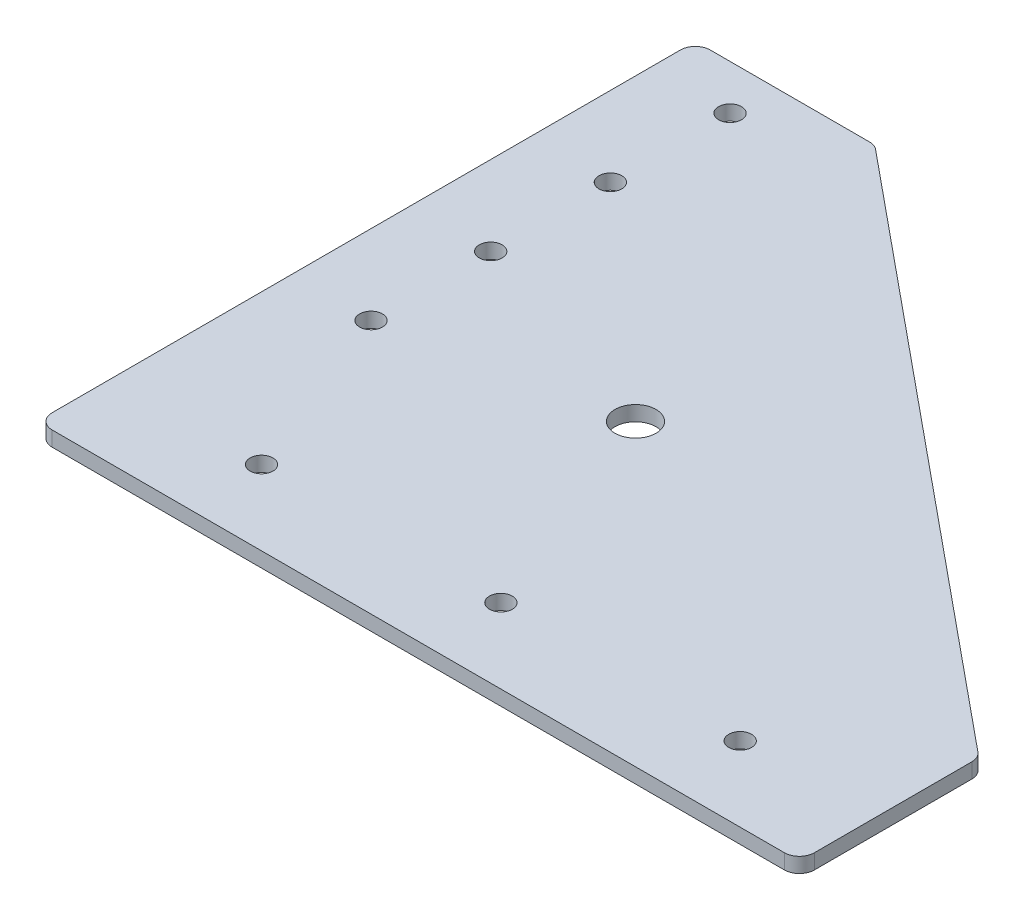
ISO-10303-21;
HEADER;
FILE_DESCRIPTION(('STEP AP214'),'2;1');
FILE_NAME('part.step','',(''),(''),'','','');
FILE_SCHEMA(('AUTOMOTIVE_DESIGN { 1 0 10303 214 1 1 1 1 }'));
ENDSEC;
DATA;
#1=APPLICATION_CONTEXT('core data for automotive mechanical design processes');
#2=APPLICATION_PROTOCOL_DEFINITION('international standard','automotive_design',2000,#1);
#3=PRODUCT_CONTEXT('',#1,'mechanical');
#4=PRODUCT('Part','Part','',(#3));
#5=PRODUCT_RELATED_PRODUCT_CATEGORY('part','',(#4));
#6=PRODUCT_DEFINITION_FORMATION('','',#4);
#7=PRODUCT_DEFINITION_CONTEXT('part definition',#1,'design');
#8=PRODUCT_DEFINITION('design','',#6,#7);
#9=PRODUCT_DEFINITION_SHAPE('','',#8);
#10=(LENGTH_UNIT() NAMED_UNIT(*) SI_UNIT(.MILLI.,.METRE.));
#11=(NAMED_UNIT(*) PLANE_ANGLE_UNIT() SI_UNIT($,.RADIAN.));
#12=(NAMED_UNIT(*) SI_UNIT($,.STERADIAN.) SOLID_ANGLE_UNIT());
#13=UNCERTAINTY_MEASURE_WITH_UNIT(LENGTH_MEASURE(1.E-05),#10,'distance_accuracy_value','');
#14=(GEOMETRIC_REPRESENTATION_CONTEXT(3) GLOBAL_UNCERTAINTY_ASSIGNED_CONTEXT((#13)) GLOBAL_UNIT_ASSIGNED_CONTEXT((#10,
#11,#12)) REPRESENTATION_CONTEXT('',''));
#15=CARTESIAN_POINT('',(0.,0.,0.));
#16=DIRECTION('',(0.,0.,1.));
#17=DIRECTION('',(1.,0.,0.));
#18=AXIS2_PLACEMENT_3D('',#15,#16,#17);
#19=CARTESIAN_POINT('',(0.,3.175,0.));
#20=DIRECTION('',(0.,1.,0.));
#21=DIRECTION('',(0.,0.,1.));
#22=AXIS2_PLACEMENT_3D('',#19,#20,#21);
#23=PLANE('',#22);
#24=CARTESIAN_POINT('',(63.5,3.175,-63.5));
#25=DIRECTION('',(0.,1.,0.));
#26=DIRECTION('',(0.,0.,1.));
#27=AXIS2_PLACEMENT_3D('',#24,#25,#26);
#28=CIRCLE('',#27,4.36880000000001);
#29=CARTESIAN_POINT('',(63.5,3.175,-59.1312));
#30=VERTEX_POINT('',#29);
#31=EDGE_CURVE('E241',#30,#30,#28,.T.);
#32=ORIENTED_EDGE('',*,*,#31,.F.);
#33=EDGE_LOOP('',(#32));
#34=FACE_BOUND('',#33,.T.);
#35=CARTESIAN_POINT('',(16.8909999999998,3.175,-104.775));
#36=DIRECTION('',(0.,1.,0.));
#37=DIRECTION('',(0.,0.,1.));
#38=AXIS2_PLACEMENT_3D('',#35,#36,#37);
#39=CIRCLE('',#38,2.4257);
#40=CARTESIAN_POINT('',(16.8909999999998,3.175,-102.3493));
#41=VERTEX_POINT('',#40);
#42=EDGE_CURVE('E226',#41,#41,#39,.T.);
#43=ORIENTED_EDGE('',*,*,#42,.F.);
#44=EDGE_LOOP('',(#43));
#45=FACE_BOUND('',#44,.T.);
#46=CARTESIAN_POINT('',(133.35,3.175,-15.875));
#47=DIRECTION('',(0.,1.,0.));
#48=DIRECTION('',(0.,0.,1.));
#49=AXIS2_PLACEMENT_3D('',#46,#47,#48);
#50=CIRCLE('',#49,2.4257);
#51=CARTESIAN_POINT('',(133.35,3.175,-13.4493));
#52=VERTEX_POINT('',#51);
#53=EDGE_CURVE('E214',#52,#52,#50,.T.);
#54=ORIENTED_EDGE('',*,*,#53,.F.);
#55=EDGE_LOOP('',(#54));
#56=FACE_BOUND('',#55,.T.);
#57=CARTESIAN_POINT('',(16.891,3.175,-53.975));
#58=DIRECTION('',(0.,1.,0.));
#59=DIRECTION('',(0.,0.,1.));
#60=AXIS2_PLACEMENT_3D('',#57,#58,#59);
#61=CIRCLE('',#60,2.4257);
#62=CARTESIAN_POINT('',(16.891,3.175,-51.5493));
#63=VERTEX_POINT('',#62);
#64=EDGE_CURVE('E203',#63,#63,#61,.T.);
#65=ORIENTED_EDGE('',*,*,#64,.F.);
#66=EDGE_LOOP('',(#65));
#67=FACE_BOUND('',#66,.T.);
#68=DIRECTION('',(-0.77273357349735,0.,-0.634730513202269));
#69=VECTOR('',#68,1.);
#70=CARTESIAN_POINT('',(38.1,3.175,-139.7));
#71=LINE('',#70,#69);
#72=CARTESIAN_POINT('',(160.630133714507,3.175,-39.0526134714806));
#73=VERTEX_POINT('',#72);
#74=CARTESIAN_POINT('',(38.9784547956886,3.175,-138.978429095854));
#75=VERTEX_POINT('',#74);
#76=EDGE_CURVE('E195',#73,#75,#71,.T.);
#77=ORIENTED_EDGE('',*,*,#76,.T.);
#78=CARTESIAN_POINT('',(36.9631854162714,3.175,-136.525));
#79=DIRECTION('',(0.,1.,0.));
#80=DIRECTION('',(0.,0.,1.));
#81=AXIS2_PLACEMENT_3D('',#78,#79,#80);
#82=CIRCLE('',#81,3.175);
#83=CARTESIAN_POINT('',(36.9631854162714,3.175,-139.7));
#84=VERTEX_POINT('',#83);
#85=EDGE_CURVE('E163',#75,#84,#82,.T.);
#86=ORIENTED_EDGE('',*,*,#85,.T.);
#87=DIRECTION('',(-1.,0.,0.));
#88=VECTOR('',#87,1.);
#89=CARTESIAN_POINT('',(0.,3.175,-139.7));
#90=LINE('',#89,#88);
#91=CARTESIAN_POINT('',(3.175,3.175,-139.7));
#92=VERTEX_POINT('',#91);
#93=EDGE_CURVE('E129',#84,#92,#90,.T.);
#94=ORIENTED_EDGE('',*,*,#93,.T.);
#95=CARTESIAN_POINT('',(3.175,3.175,-136.525));
#96=DIRECTION('',(0.,1.,0.));
#97=DIRECTION('',(0.,0.,1.));
#98=AXIS2_PLACEMENT_3D('',#95,#96,#97);
#99=CIRCLE('',#98,3.175);
#100=CARTESIAN_POINT('',(0.,3.175,-136.525));
#101=VERTEX_POINT('',#100);
#102=EDGE_CURVE('E54',#92,#101,#99,.T.);
#103=ORIENTED_EDGE('',*,*,#102,.T.);
#104=DIRECTION('',(0.,0.,1.));
#105=VECTOR('',#104,1.);
#106=CARTESIAN_POINT('',(0.,3.175,0.));
#107=LINE('',#106,#105);
#108=CARTESIAN_POINT('',(0.,3.175,-3.175));
#109=VERTEX_POINT('',#108);
#110=EDGE_CURVE('E145',#101,#109,#107,.T.);
#111=ORIENTED_EDGE('',*,*,#110,.T.);
#112=CARTESIAN_POINT('',(3.175,3.175,-3.175));
#113=DIRECTION('',(0.,1.,0.));
#114=DIRECTION('',(0.,0.,1.));
#115=AXIS2_PLACEMENT_3D('',#112,#113,#114);
#116=CIRCLE('',#115,3.175);
#117=CARTESIAN_POINT('',(3.175,3.175,0.));
#118=VERTEX_POINT('',#117);
#119=EDGE_CURVE('E156',#109,#118,#116,.T.);
#120=ORIENTED_EDGE('',*,*,#119,.T.);
#121=DIRECTION('',(1.,0.,0.));
#122=VECTOR('',#121,1.);
#123=CARTESIAN_POINT('',(0.,3.175,0.));
#124=LINE('',#123,#122);
#125=CARTESIAN_POINT('',(158.61486433509,3.175,0.));
#126=VERTEX_POINT('',#125);
#127=EDGE_CURVE('E139',#118,#126,#124,.T.);
#128=ORIENTED_EDGE('',*,*,#127,.T.);
#129=CARTESIAN_POINT('',(158.61486433509,3.175,-3.17500000000001));
#130=DIRECTION('',(0.,1.,0.));
#131=DIRECTION('',(0.,0.,1.));
#132=AXIS2_PLACEMENT_3D('',#129,#130,#131);
#133=CIRCLE('',#132,3.175);
#134=CARTESIAN_POINT('',(161.78986433509,3.175,-3.175));
#135=VERTEX_POINT('',#134);
#136=EDGE_CURVE('E158',#126,#135,#133,.T.);
#137=ORIENTED_EDGE('',*,*,#136,.T.);
#138=DIRECTION('',(0.,0.,-1.));
#139=VECTOR('',#138,1.);
#140=CARTESIAN_POINT('',(161.78986433509,3.175,0.));
#141=LINE('',#140,#139);
#142=CARTESIAN_POINT('',(161.78986433509,3.175,-36.5991843756265));
#143=VERTEX_POINT('',#142);
#144=EDGE_CURVE('E198',#135,#143,#141,.T.);
#145=ORIENTED_EDGE('',*,*,#144,.T.);
#146=CARTESIAN_POINT('',(158.61486433509,3.175,-36.5991843756265));
#147=DIRECTION('',(0.,1.,0.));
#148=DIRECTION('',(0.,0.,1.));
#149=AXIS2_PLACEMENT_3D('',#146,#147,#148);
#150=CIRCLE('',#149,3.175);
#151=EDGE_CURVE('E160',#143,#73,#150,.T.);
#152=ORIENTED_EDGE('',*,*,#151,.T.);
#153=EDGE_LOOP('',(#77,#86,#94,#103,#111,#120,#128,#137,#145,#152));
#154=FACE_BOUND('',#153,.T.);
#155=CARTESIAN_POINT('',(31.75,3.175,-15.875));
#156=DIRECTION('',(0.,1.,0.));
#157=DIRECTION('',(0.,0.,1.));
#158=AXIS2_PLACEMENT_3D('',#155,#156,#157);
#159=CIRCLE('',#158,2.4257);
#160=CARTESIAN_POINT('',(31.75,3.175,-13.4493));
#161=VERTEX_POINT('',#160);
#162=EDGE_CURVE('E186',#161,#161,#159,.T.);
#163=ORIENTED_EDGE('',*,*,#162,.F.);
#164=EDGE_LOOP('',(#163));
#165=FACE_BOUND('',#164,.T.);
#166=CARTESIAN_POINT('',(82.55,3.175,-15.875));
#167=DIRECTION('',(0.,1.,0.));
#168=DIRECTION('',(0.,0.,1.));
#169=AXIS2_PLACEMENT_3D('',#166,#167,#168);
#170=CIRCLE('',#169,2.42570000000001);
#171=CARTESIAN_POINT('',(82.55,3.175,-13.4493));
#172=VERTEX_POINT('',#171);
#173=EDGE_CURVE('E208',#172,#172,#170,.T.);
#174=ORIENTED_EDGE('',*,*,#173,.F.);
#175=EDGE_LOOP('',(#174));
#176=FACE_BOUND('',#175,.T.);
#177=CARTESIAN_POINT('',(16.8909999999999,3.175,-79.375));
#178=DIRECTION('',(0.,1.,0.));
#179=DIRECTION('',(0.,0.,1.));
#180=AXIS2_PLACEMENT_3D('',#177,#178,#179);
#181=CIRCLE('',#180,2.4257);
#182=CARTESIAN_POINT('',(16.8909999999999,3.175,-76.9493));
#183=VERTEX_POINT('',#182);
#184=EDGE_CURVE('E220',#183,#183,#181,.T.);
#185=ORIENTED_EDGE('',*,*,#184,.F.);
#186=EDGE_LOOP('',(#185));
#187=FACE_BOUND('',#186,.T.);
#188=CARTESIAN_POINT('',(16.8909999999997,3.175,-130.175));
#189=DIRECTION('',(0.,1.,0.));
#190=DIRECTION('',(0.,0.,1.));
#191=AXIS2_PLACEMENT_3D('',#188,#189,#190);
#192=CIRCLE('',#191,2.4257);
#193=CARTESIAN_POINT('',(16.8909999999997,3.175,-127.7493));
#194=VERTEX_POINT('',#193);
#195=EDGE_CURVE('E232',#194,#194,#192,.T.);
#196=ORIENTED_EDGE('',*,*,#195,.F.);
#197=EDGE_LOOP('',(#196));
#198=FACE_BOUND('',#197,.T.);
#199=ADVANCED_FACE('F32',(#34,#45,#56,#67,#154,#165,#176,#187,#198),#23,.T.);
#200=CARTESIAN_POINT('',(0.,0.,0.));
#201=DIRECTION('',(0.,1.,0.));
#202=DIRECTION('',(0.,0.,1.));
#203=AXIS2_PLACEMENT_3D('',#200,#201,#202);
#204=PLANE('',#203);
#205=CARTESIAN_POINT('',(63.5,0.,-63.5));
#206=DIRECTION('',(0.,1.,0.));
#207=DIRECTION('',(0.,0.,1.));
#208=AXIS2_PLACEMENT_3D('',#205,#206,#207);
#209=CIRCLE('',#208,4.36880000000001);
#210=CARTESIAN_POINT('',(63.5,0.,-59.1312));
#211=VERTEX_POINT('',#210);
#212=EDGE_CURVE('E238',#211,#211,#209,.T.);
#213=ORIENTED_EDGE('',*,*,#212,.T.);
#214=EDGE_LOOP('',(#213));
#215=FACE_BOUND('',#214,.T.);
#216=DIRECTION('',(-1.,0.,0.));
#217=VECTOR('',#216,1.);
#218=CARTESIAN_POINT('',(0.,0.,-139.7));
#219=LINE('',#218,#217);
#220=CARTESIAN_POINT('',(36.9631854162714,0.,-139.7));
#221=VERTEX_POINT('',#220);
#222=CARTESIAN_POINT('',(3.175,0.,-139.7));
#223=VERTEX_POINT('',#222);
#224=EDGE_CURVE('E127',#221,#223,#219,.T.);
#225=ORIENTED_EDGE('',*,*,#224,.F.);
#226=CARTESIAN_POINT('',(36.9631854162714,0.,-136.525));
#227=DIRECTION('',(0.,1.,0.));
#228=DIRECTION('',(0.,0.,1.));
#229=AXIS2_PLACEMENT_3D('',#226,#227,#228);
#230=CIRCLE('',#229,3.175);
#231=CARTESIAN_POINT('',(38.9784547956886,0.,-138.978429095854));
#232=VERTEX_POINT('',#231);
#233=EDGE_CURVE('E110',#221,#232,#230,.F.);
#234=ORIENTED_EDGE('',*,*,#233,.T.);
#235=DIRECTION('',(-0.77273357349735,0.,-0.634730513202269));
#236=VECTOR('',#235,1.);
#237=CARTESIAN_POINT('',(38.1,0.,-139.7));
#238=LINE('',#237,#236);
#239=CARTESIAN_POINT('',(160.630133714507,0.,-39.0526134714806));
#240=VERTEX_POINT('',#239);
#241=EDGE_CURVE('E137',#240,#232,#238,.T.);
#242=ORIENTED_EDGE('',*,*,#241,.F.);
#243=CARTESIAN_POINT('',(158.61486433509,0.,-36.5991843756265));
#244=DIRECTION('',(0.,1.,0.));
#245=DIRECTION('',(0.,0.,1.));
#246=AXIS2_PLACEMENT_3D('',#243,#244,#245);
#247=CIRCLE('',#246,3.175);
#248=CARTESIAN_POINT('',(161.78986433509,0.,-36.5991843756265));
#249=VERTEX_POINT('',#248);
#250=EDGE_CURVE('E150',#240,#249,#247,.F.);
#251=ORIENTED_EDGE('',*,*,#250,.T.);
#252=DIRECTION('',(0.,0.,-1.));
#253=VECTOR('',#252,1.);
#254=CARTESIAN_POINT('',(161.78986433509,0.,0.));
#255=LINE('',#254,#253);
#256=CARTESIAN_POINT('',(161.78986433509,0.,-3.175));
#257=VERTEX_POINT('',#256);
#258=EDGE_CURVE('E141',#257,#249,#255,.T.);
#259=ORIENTED_EDGE('',*,*,#258,.F.);
#260=CARTESIAN_POINT('',(158.61486433509,0.,-3.17500000000001));
#261=DIRECTION('',(0.,1.,0.));
#262=DIRECTION('',(0.,0.,1.));
#263=AXIS2_PLACEMENT_3D('',#260,#261,#262);
#264=CIRCLE('',#263,3.175);
#265=CARTESIAN_POINT('',(158.61486433509,0.,0.));
#266=VERTEX_POINT('',#265);
#267=EDGE_CURVE('E148',#257,#266,#264,.F.);
#268=ORIENTED_EDGE('',*,*,#267,.T.);
#269=DIRECTION('',(1.,0.,0.));
#270=VECTOR('',#269,1.);
#271=CARTESIAN_POINT('',(0.,0.,0.));
#272=LINE('',#271,#270);
#273=CARTESIAN_POINT('',(3.175,0.,0.));
#274=VERTEX_POINT('',#273);
#275=EDGE_CURVE('E180',#274,#266,#272,.T.);
#276=ORIENTED_EDGE('',*,*,#275,.F.);
#277=CARTESIAN_POINT('',(3.175,0.,-3.175));
#278=DIRECTION('',(0.,1.,0.));
#279=DIRECTION('',(0.,0.,1.));
#280=AXIS2_PLACEMENT_3D('',#277,#278,#279);
#281=CIRCLE('',#280,3.175);
#282=CARTESIAN_POINT('',(0.,0.,-3.175));
#283=VERTEX_POINT('',#282);
#284=EDGE_CURVE('E130',#274,#283,#281,.F.);
#285=ORIENTED_EDGE('',*,*,#284,.T.);
#286=DIRECTION('',(0.,0.,1.));
#287=VECTOR('',#286,1.);
#288=CARTESIAN_POINT('',(0.,0.,0.));
#289=LINE('',#288,#287);
#290=CARTESIAN_POINT('',(0.,0.,-136.525));
#291=VERTEX_POINT('',#290);
#292=EDGE_CURVE('E136',#291,#283,#289,.T.);
#293=ORIENTED_EDGE('',*,*,#292,.F.);
#294=CARTESIAN_POINT('',(3.175,0.,-136.525));
#295=DIRECTION('',(0.,1.,0.));
#296=DIRECTION('',(0.,0.,1.));
#297=AXIS2_PLACEMENT_3D('',#294,#295,#296);
#298=CIRCLE('',#297,3.175);
#299=EDGE_CURVE('E121',#291,#223,#298,.F.);
#300=ORIENTED_EDGE('',*,*,#299,.T.);
#301=EDGE_LOOP('',(#225,#234,#242,#251,#259,#268,#276,#285,#293,#300));
#302=FACE_BOUND('',#301,.T.);
#303=CARTESIAN_POINT('',(31.75,0.,-15.875));
#304=DIRECTION('',(0.,1.,0.));
#305=DIRECTION('',(0.,0.,1.));
#306=AXIS2_PLACEMENT_3D('',#303,#304,#305);
#307=CIRCLE('',#306,2.4257);
#308=CARTESIAN_POINT('',(31.75,0.,-13.4493));
#309=VERTEX_POINT('',#308);
#310=EDGE_CURVE('E190',#309,#309,#307,.T.);
#311=ORIENTED_EDGE('',*,*,#310,.T.);
#312=EDGE_LOOP('',(#311));
#313=FACE_BOUND('',#312,.T.);
#314=CARTESIAN_POINT('',(16.891,0.,-53.975));
#315=DIRECTION('',(0.,1.,0.));
#316=DIRECTION('',(0.,0.,1.));
#317=AXIS2_PLACEMENT_3D('',#314,#315,#316);
#318=CIRCLE('',#317,2.4257);
#319=CARTESIAN_POINT('',(16.891,0.,-51.5493));
#320=VERTEX_POINT('',#319);
#321=EDGE_CURVE('E205',#320,#320,#318,.T.);
#322=ORIENTED_EDGE('',*,*,#321,.T.);
#323=EDGE_LOOP('',(#322));
#324=FACE_BOUND('',#323,.T.);
#325=CARTESIAN_POINT('',(82.55,0.,-15.875));
#326=DIRECTION('',(0.,1.,0.));
#327=DIRECTION('',(0.,0.,1.));
#328=AXIS2_PLACEMENT_3D('',#325,#326,#327);
#329=CIRCLE('',#328,2.42570000000001);
#330=CARTESIAN_POINT('',(82.55,0.,-13.4493));
#331=VERTEX_POINT('',#330);
#332=EDGE_CURVE('E211',#331,#331,#329,.T.);
#333=ORIENTED_EDGE('',*,*,#332,.T.);
#334=EDGE_LOOP('',(#333));
#335=FACE_BOUND('',#334,.T.);
#336=CARTESIAN_POINT('',(133.35,0.,-15.875));
#337=DIRECTION('',(0.,1.,0.));
#338=DIRECTION('',(0.,0.,1.));
#339=AXIS2_PLACEMENT_3D('',#336,#337,#338);
#340=CIRCLE('',#339,2.4257);
#341=CARTESIAN_POINT('',(133.35,0.,-13.4493));
#342=VERTEX_POINT('',#341);
#343=EDGE_CURVE('E217',#342,#342,#340,.T.);
#344=ORIENTED_EDGE('',*,*,#343,.T.);
#345=EDGE_LOOP('',(#344));
#346=FACE_BOUND('',#345,.T.);
#347=CARTESIAN_POINT('',(16.8909999999999,0.,-79.375));
#348=DIRECTION('',(0.,1.,0.));
#349=DIRECTION('',(0.,0.,1.));
#350=AXIS2_PLACEMENT_3D('',#347,#348,#349);
#351=CIRCLE('',#350,2.4257);
#352=CARTESIAN_POINT('',(16.8909999999999,0.,-76.9493));
#353=VERTEX_POINT('',#352);
#354=EDGE_CURVE('E223',#353,#353,#351,.T.);
#355=ORIENTED_EDGE('',*,*,#354,.T.);
#356=EDGE_LOOP('',(#355));
#357=FACE_BOUND('',#356,.T.);
#358=CARTESIAN_POINT('',(16.8909999999998,0.,-104.775));
#359=DIRECTION('',(0.,1.,0.));
#360=DIRECTION('',(0.,0.,1.));
#361=AXIS2_PLACEMENT_3D('',#358,#359,#360);
#362=CIRCLE('',#361,2.4257);
#363=CARTESIAN_POINT('',(16.8909999999998,0.,-102.3493));
#364=VERTEX_POINT('',#363);
#365=EDGE_CURVE('E229',#364,#364,#362,.T.);
#366=ORIENTED_EDGE('',*,*,#365,.T.);
#367=EDGE_LOOP('',(#366));
#368=FACE_BOUND('',#367,.T.);
#369=CARTESIAN_POINT('',(16.8909999999997,0.,-130.175));
#370=DIRECTION('',(0.,1.,0.));
#371=DIRECTION('',(0.,0.,1.));
#372=AXIS2_PLACEMENT_3D('',#369,#370,#371);
#373=CIRCLE('',#372,2.4257);
#374=CARTESIAN_POINT('',(16.8909999999997,0.,-127.7493));
#375=VERTEX_POINT('',#374);
#376=EDGE_CURVE('E235',#375,#375,#373,.T.);
#377=ORIENTED_EDGE('',*,*,#376,.T.);
#378=EDGE_LOOP('',(#377));
#379=FACE_BOUND('',#378,.T.);
#380=ADVANCED_FACE('F133',(#215,#302,#313,#324,#335,#346,#357,#368,#379),#204,.F.);
#381=CARTESIAN_POINT('',(0.,3.175,0.));
#382=DIRECTION('',(0.,0.,-1.));
#383=DIRECTION('',(-1.,0.,0.));
#384=AXIS2_PLACEMENT_3D('',#381,#382,#383);
#385=PLANE('',#384);
#386=ORIENTED_EDGE('',*,*,#275,.T.);
#387=DIRECTION('',(0.,-1.,0.));
#388=VECTOR('',#387,1.);
#389=CARTESIAN_POINT('',(158.61486433509,3.175,0.));
#390=LINE('',#389,#388);
#391=EDGE_CURVE('E11',#266,#126,#390,.F.);
#392=ORIENTED_EDGE('',*,*,#391,.T.);
#393=ORIENTED_EDGE('',*,*,#127,.F.);
#394=DIRECTION('',(0.,-1.,0.));
#395=VECTOR('',#394,1.);
#396=CARTESIAN_POINT('',(3.175,3.175,0.));
#397=LINE('',#396,#395);
#398=EDGE_CURVE('E40',#118,#274,#397,.T.);
#399=ORIENTED_EDGE('',*,*,#398,.T.);
#400=EDGE_LOOP('',(#386,#392,#393,#399));
#401=FACE_BOUND('',#400,.T.);
#402=ADVANCED_FACE('F179',(#401),#385,.F.);
#403=CARTESIAN_POINT('',(161.78986433509,3.175,0.));
#404=DIRECTION('',(-1.,0.,0.));
#405=DIRECTION('',(0.,0.,1.));
#406=AXIS2_PLACEMENT_3D('',#403,#404,#405);
#407=PLANE('',#406);
#408=ORIENTED_EDGE('',*,*,#258,.T.);
#409=DIRECTION('',(0.,-1.,0.));
#410=VECTOR('',#409,1.);
#411=CARTESIAN_POINT('',(161.78986433509,3.175,-36.5991843756265));
#412=LINE('',#411,#410);
#413=EDGE_CURVE('E172',#249,#143,#412,.F.);
#414=ORIENTED_EDGE('',*,*,#413,.T.);
#415=ORIENTED_EDGE('',*,*,#144,.F.);
#416=DIRECTION('',(0.,-1.,0.));
#417=VECTOR('',#416,1.);
#418=CARTESIAN_POINT('',(161.78986433509,3.175,-3.175));
#419=LINE('',#418,#417);
#420=EDGE_CURVE('E169',#135,#257,#419,.T.);
#421=ORIENTED_EDGE('',*,*,#420,.T.);
#422=EDGE_LOOP('',(#408,#414,#415,#421));
#423=FACE_BOUND('',#422,.T.);
#424=ADVANCED_FACE('F284',(#423),#407,.F.);
#425=CARTESIAN_POINT('',(38.1,3.175,-139.7));
#426=DIRECTION('',(-0.634730513202269,0.,0.77273357349735));
#427=DIRECTION('',(0.77273357349735,0.,0.634730513202269));
#428=AXIS2_PLACEMENT_3D('',#425,#426,#427);
#429=PLANE('',#428);
#430=ORIENTED_EDGE('',*,*,#241,.T.);
#431=DIRECTION('',(0.,-1.,0.));
#432=VECTOR('',#431,1.);
#433=CARTESIAN_POINT('',(38.9784547956886,3.175,-138.978429095854));
#434=LINE('',#433,#432);
#435=EDGE_CURVE('E115',#232,#75,#434,.F.);
#436=ORIENTED_EDGE('',*,*,#435,.T.);
#437=ORIENTED_EDGE('',*,*,#76,.F.);
#438=DIRECTION('',(0.,-1.,0.));
#439=VECTOR('',#438,1.);
#440=CARTESIAN_POINT('',(160.630133714507,3.175,-39.0526134714806));
#441=LINE('',#440,#439);
#442=EDGE_CURVE('E120',#73,#240,#441,.T.);
#443=ORIENTED_EDGE('',*,*,#442,.T.);
#444=EDGE_LOOP('',(#430,#436,#437,#443));
#445=FACE_BOUND('',#444,.T.);
#446=ADVANCED_FACE('F294',(#445),#429,.F.);
#447=CARTESIAN_POINT('',(0.,3.175,-139.7));
#448=DIRECTION('',(0.,0.,1.));
#449=DIRECTION('',(1.,0.,0.));
#450=AXIS2_PLACEMENT_3D('',#447,#448,#449);
#451=PLANE('',#450);
#452=ORIENTED_EDGE('',*,*,#93,.F.);
#453=DIRECTION('',(0.,-1.,0.));
#454=VECTOR('',#453,1.);
#455=CARTESIAN_POINT('',(36.9631854162714,3.175,-139.7));
#456=LINE('',#455,#454);
#457=EDGE_CURVE('E114',#84,#221,#456,.T.);
#458=ORIENTED_EDGE('',*,*,#457,.T.);
#459=ORIENTED_EDGE('',*,*,#224,.T.);
#460=DIRECTION('',(0.,-1.,0.));
#461=VECTOR('',#460,1.);
#462=CARTESIAN_POINT('',(3.175,3.175,-139.7));
#463=LINE('',#462,#461);
#464=EDGE_CURVE('E131',#223,#92,#463,.F.);
#465=ORIENTED_EDGE('',*,*,#464,.T.);
#466=EDGE_LOOP('',(#452,#458,#459,#465));
#467=FACE_BOUND('',#466,.T.);
#468=ADVANCED_FACE('F126',(#467),#451,.F.);
#469=CARTESIAN_POINT('',(0.,3.175,0.));
#470=DIRECTION('',(1.,0.,0.));
#471=DIRECTION('',(0.,0.,-1.));
#472=AXIS2_PLACEMENT_3D('',#469,#470,#471);
#473=PLANE('',#472);
#474=ORIENTED_EDGE('',*,*,#110,.F.);
#475=DIRECTION('',(0.,-1.,0.));
#476=VECTOR('',#475,1.);
#477=CARTESIAN_POINT('',(0.,3.175,-136.525));
#478=LINE('',#477,#476);
#479=EDGE_CURVE('E166',#101,#291,#478,.T.);
#480=ORIENTED_EDGE('',*,*,#479,.T.);
#481=ORIENTED_EDGE('',*,*,#292,.T.);
#482=DIRECTION('',(0.,-1.,0.));
#483=VECTOR('',#482,1.);
#484=CARTESIAN_POINT('',(0.,3.175,-3.175));
#485=LINE('',#484,#483);
#486=EDGE_CURVE('E47',#283,#109,#485,.F.);
#487=ORIENTED_EDGE('',*,*,#486,.T.);
#488=EDGE_LOOP('',(#474,#480,#481,#487));
#489=FACE_BOUND('',#488,.T.);
#490=ADVANCED_FACE('F288',(#489),#473,.F.);
#491=CARTESIAN_POINT('',(31.75,3.175,-15.875));
#492=DIRECTION('',(0.,-1.,0.));
#493=DIRECTION('',(0.,0.,-1.));
#494=AXIS2_PLACEMENT_3D('',#491,#492,#493);
#495=CYLINDRICAL_SURFACE('',#494,2.4257);
#496=ORIENTED_EDGE('',*,*,#162,.T.);
#497=EDGE_LOOP('',(#496));
#498=FACE_BOUND('',#497,.T.);
#499=ORIENTED_EDGE('',*,*,#310,.F.);
#500=EDGE_LOOP('',(#499));
#501=FACE_BOUND('',#500,.T.);
#502=ADVANCED_FACE('F291',(#498,#501),#495,.F.);
#503=CARTESIAN_POINT('',(16.891,3.175,-53.975));
#504=DIRECTION('',(0.,-1.,0.));
#505=DIRECTION('',(0.,0.,-1.));
#506=AXIS2_PLACEMENT_3D('',#503,#504,#505);
#507=CYLINDRICAL_SURFACE('',#506,2.4257);
#508=ORIENTED_EDGE('',*,*,#64,.T.);
#509=EDGE_LOOP('',(#508));
#510=FACE_BOUND('',#509,.T.);
#511=ORIENTED_EDGE('',*,*,#321,.F.);
#512=EDGE_LOOP('',(#511));
#513=FACE_BOUND('',#512,.T.);
#514=ADVANCED_FACE('F376',(#510,#513),#507,.F.);
#515=CARTESIAN_POINT('',(82.55,3.175,-15.875));
#516=DIRECTION('',(0.,-1.,0.));
#517=DIRECTION('',(0.,0.,-1.));
#518=AXIS2_PLACEMENT_3D('',#515,#516,#517);
#519=CYLINDRICAL_SURFACE('',#518,2.42570000000001);
#520=ORIENTED_EDGE('',*,*,#173,.T.);
#521=EDGE_LOOP('',(#520));
#522=FACE_BOUND('',#521,.T.);
#523=ORIENTED_EDGE('',*,*,#332,.F.);
#524=EDGE_LOOP('',(#523));
#525=FACE_BOUND('',#524,.T.);
#526=ADVANCED_FACE('F384',(#522,#525),#519,.F.);
#527=CARTESIAN_POINT('',(133.35,3.175,-15.875));
#528=DIRECTION('',(0.,-1.,0.));
#529=DIRECTION('',(0.,0.,-1.));
#530=AXIS2_PLACEMENT_3D('',#527,#528,#529);
#531=CYLINDRICAL_SURFACE('',#530,2.4257);
#532=ORIENTED_EDGE('',*,*,#53,.T.);
#533=EDGE_LOOP('',(#532));
#534=FACE_BOUND('',#533,.T.);
#535=ORIENTED_EDGE('',*,*,#343,.F.);
#536=EDGE_LOOP('',(#535));
#537=FACE_BOUND('',#536,.T.);
#538=ADVANCED_FACE('F393',(#534,#537),#531,.F.);
#539=CARTESIAN_POINT('',(16.8909999999999,3.175,-79.375));
#540=DIRECTION('',(0.,-1.,0.));
#541=DIRECTION('',(0.,0.,-1.));
#542=AXIS2_PLACEMENT_3D('',#539,#540,#541);
#543=CYLINDRICAL_SURFACE('',#542,2.4257);
#544=ORIENTED_EDGE('',*,*,#184,.T.);
#545=EDGE_LOOP('',(#544));
#546=FACE_BOUND('',#545,.T.);
#547=ORIENTED_EDGE('',*,*,#354,.F.);
#548=EDGE_LOOP('',(#547));
#549=FACE_BOUND('',#548,.T.);
#550=ADVANCED_FACE('F402',(#546,#549),#543,.F.);
#551=CARTESIAN_POINT('',(16.8909999999998,3.175,-104.775));
#552=DIRECTION('',(0.,-1.,0.));
#553=DIRECTION('',(0.,0.,-1.));
#554=AXIS2_PLACEMENT_3D('',#551,#552,#553);
#555=CYLINDRICAL_SURFACE('',#554,2.4257);
#556=ORIENTED_EDGE('',*,*,#42,.T.);
#557=EDGE_LOOP('',(#556));
#558=FACE_BOUND('',#557,.T.);
#559=ORIENTED_EDGE('',*,*,#365,.F.);
#560=EDGE_LOOP('',(#559));
#561=FACE_BOUND('',#560,.T.);
#562=ADVANCED_FACE('F275',(#558,#561),#555,.F.);
#563=CARTESIAN_POINT('',(16.8909999999997,3.175,-130.175));
#564=DIRECTION('',(0.,-1.,0.));
#565=DIRECTION('',(0.,0.,-1.));
#566=AXIS2_PLACEMENT_3D('',#563,#564,#565);
#567=CYLINDRICAL_SURFACE('',#566,2.4257);
#568=ORIENTED_EDGE('',*,*,#195,.T.);
#569=EDGE_LOOP('',(#568));
#570=FACE_BOUND('',#569,.T.);
#571=ORIENTED_EDGE('',*,*,#376,.F.);
#572=EDGE_LOOP('',(#571));
#573=FACE_BOUND('',#572,.T.);
#574=ADVANCED_FACE('F272',(#570,#573),#567,.F.);
#575=CARTESIAN_POINT('',(36.9631854162714,3.175,-136.525));
#576=DIRECTION('',(0.,-1.,0.));
#577=DIRECTION('',(0.,0.,-1.));
#578=AXIS2_PLACEMENT_3D('',#575,#576,#577);
#579=CYLINDRICAL_SURFACE('',#578,3.175);
#580=ORIENTED_EDGE('',*,*,#85,.F.);
#581=ORIENTED_EDGE('',*,*,#435,.F.);
#582=ORIENTED_EDGE('',*,*,#233,.F.);
#583=ORIENTED_EDGE('',*,*,#457,.F.);
#584=EDGE_LOOP('',(#580,#581,#582,#583));
#585=FACE_BOUND('',#584,.T.);
#586=ADVANCED_FACE('F113',(#585),#579,.T.);
#587=CARTESIAN_POINT('',(3.175,3.175,-136.525));
#588=DIRECTION('',(0.,-1.,0.));
#589=DIRECTION('',(0.,0.,-1.));
#590=AXIS2_PLACEMENT_3D('',#587,#588,#589);
#591=CYLINDRICAL_SURFACE('',#590,3.175);
#592=ORIENTED_EDGE('',*,*,#102,.F.);
#593=ORIENTED_EDGE('',*,*,#464,.F.);
#594=ORIENTED_EDGE('',*,*,#299,.F.);
#595=ORIENTED_EDGE('',*,*,#479,.F.);
#596=EDGE_LOOP('',(#592,#593,#594,#595));
#597=FACE_BOUND('',#596,.T.);
#598=ADVANCED_FACE('F303',(#597),#591,.T.);
#599=CARTESIAN_POINT('',(158.61486433509,3.175,-36.5991843756265));
#600=DIRECTION('',(0.,-1.,0.));
#601=DIRECTION('',(0.,0.,-1.));
#602=AXIS2_PLACEMENT_3D('',#599,#600,#601);
#603=CYLINDRICAL_SURFACE('',#602,3.175);
#604=ORIENTED_EDGE('',*,*,#151,.F.);
#605=ORIENTED_EDGE('',*,*,#413,.F.);
#606=ORIENTED_EDGE('',*,*,#250,.F.);
#607=ORIENTED_EDGE('',*,*,#442,.F.);
#608=EDGE_LOOP('',(#604,#605,#606,#607));
#609=FACE_BOUND('',#608,.T.);
#610=ADVANCED_FACE('F306',(#609),#603,.T.);
#611=CARTESIAN_POINT('',(158.61486433509,3.175,-3.17500000000001));
#612=DIRECTION('',(0.,-1.,0.));
#613=DIRECTION('',(0.,0.,-1.));
#614=AXIS2_PLACEMENT_3D('',#611,#612,#613);
#615=CYLINDRICAL_SURFACE('',#614,3.175);
#616=ORIENTED_EDGE('',*,*,#136,.F.);
#617=ORIENTED_EDGE('',*,*,#391,.F.);
#618=ORIENTED_EDGE('',*,*,#267,.F.);
#619=ORIENTED_EDGE('',*,*,#420,.F.);
#620=EDGE_LOOP('',(#616,#617,#618,#619));
#621=FACE_BOUND('',#620,.T.);
#622=ADVANCED_FACE('F309',(#621),#615,.T.);
#623=CARTESIAN_POINT('',(3.175,3.175,-3.175));
#624=DIRECTION('',(0.,-1.,0.));
#625=DIRECTION('',(0.,0.,-1.));
#626=AXIS2_PLACEMENT_3D('',#623,#624,#625);
#627=CYLINDRICAL_SURFACE('',#626,3.175);
#628=ORIENTED_EDGE('',*,*,#119,.F.);
#629=ORIENTED_EDGE('',*,*,#486,.F.);
#630=ORIENTED_EDGE('',*,*,#284,.F.);
#631=ORIENTED_EDGE('',*,*,#398,.F.);
#632=EDGE_LOOP('',(#628,#629,#630,#631));
#633=FACE_BOUND('',#632,.T.);
#634=ADVANCED_FACE('F34',(#633),#627,.T.);
#635=CARTESIAN_POINT('',(63.5,0.,-63.5));
#636=DIRECTION('',(0.,1.,0.));
#637=DIRECTION('',(0.,0.,1.));
#638=AXIS2_PLACEMENT_3D('',#635,#636,#637);
#639=CYLINDRICAL_SURFACE('',#638,4.36880000000001);
#640=ORIENTED_EDGE('',*,*,#212,.F.);
#641=EDGE_LOOP('',(#640));
#642=FACE_BOUND('',#641,.T.);
#643=ORIENTED_EDGE('',*,*,#31,.T.);
#644=EDGE_LOOP('',(#643));
#645=FACE_BOUND('',#644,.T.);
#646=ADVANCED_FACE('F248',(#642,#645),#639,.F.);
#647=CLOSED_SHELL('',(#199,#380,#402,#424,#446,#468,#490,#502,#514,#526,#538,#550,#562,#574,
#586,#598,#610,#622,#634,#646));
#648=MANIFOLD_SOLID_BREP('B2',#647);
#649=ADVANCED_BREP_SHAPE_REPRESENTATION('',(#18,#648),#14);
#650=SHAPE_DEFINITION_REPRESENTATION(#9,#649);
ENDSEC;
END-ISO-10303-21;
